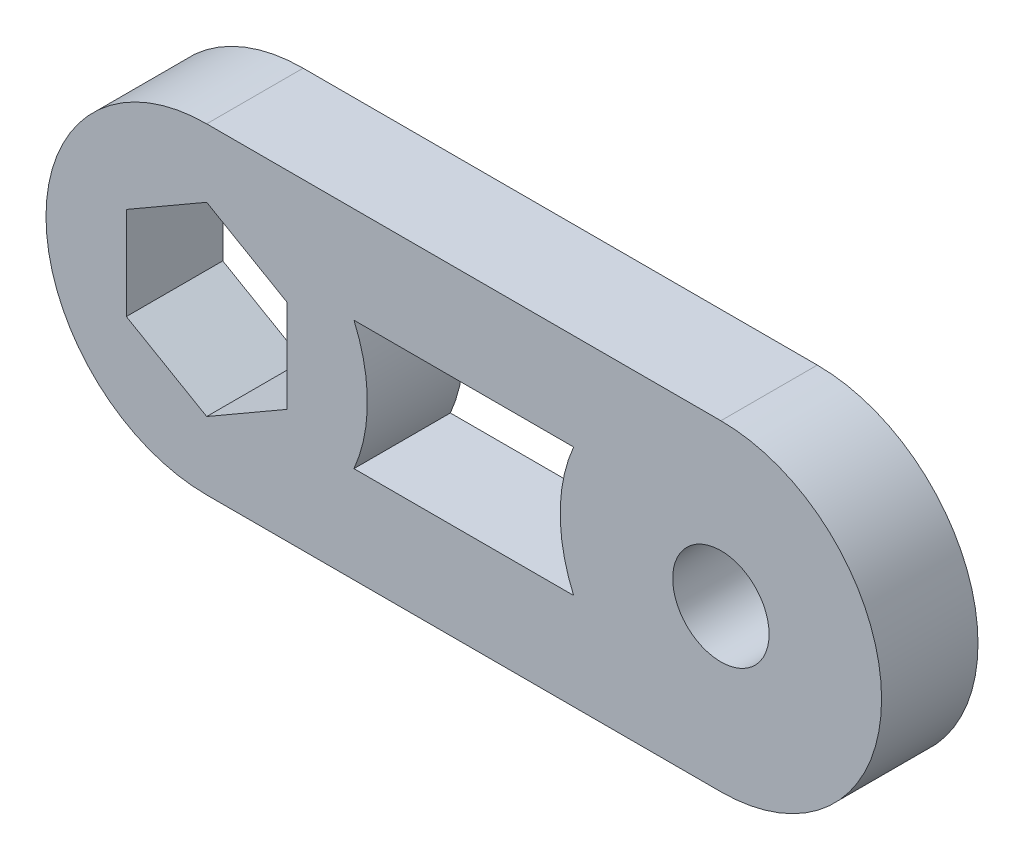
ISO-10303-21;
HEADER;
FILE_DESCRIPTION(('STEP AP214'),'2;1');
FILE_NAME('part.step','',(''),(''),'','','');
FILE_SCHEMA(('AUTOMOTIVE_DESIGN { 1 0 10303 214 1 1 1 1 }'));
ENDSEC;
DATA;
#1=APPLICATION_CONTEXT('core data for automotive mechanical design processes');
#2=APPLICATION_PROTOCOL_DEFINITION('international standard','automotive_design',2000,#1);
#3=PRODUCT_CONTEXT('',#1,'mechanical');
#4=PRODUCT('Part','Part','',(#3));
#5=PRODUCT_RELATED_PRODUCT_CATEGORY('part','',(#4));
#6=PRODUCT_DEFINITION_FORMATION('','',#4);
#7=PRODUCT_DEFINITION_CONTEXT('part definition',#1,'design');
#8=PRODUCT_DEFINITION('design','',#6,#7);
#9=PRODUCT_DEFINITION_SHAPE('','',#8);
#10=(LENGTH_UNIT() NAMED_UNIT(*) SI_UNIT(.MILLI.,.METRE.));
#11=(NAMED_UNIT(*) PLANE_ANGLE_UNIT() SI_UNIT($,.RADIAN.));
#12=(NAMED_UNIT(*) SI_UNIT($,.STERADIAN.) SOLID_ANGLE_UNIT());
#13=UNCERTAINTY_MEASURE_WITH_UNIT(LENGTH_MEASURE(1.E-05),#10,'distance_accuracy_value','');
#14=(GEOMETRIC_REPRESENTATION_CONTEXT(3) GLOBAL_UNCERTAINTY_ASSIGNED_CONTEXT((#13)) GLOBAL_UNIT_ASSIGNED_CONTEXT((#10,
#11,#12)) REPRESENTATION_CONTEXT('',''));
#15=CARTESIAN_POINT('',(0.,0.,0.));
#16=DIRECTION('',(0.,0.,1.));
#17=DIRECTION('',(1.,0.,0.));
#18=AXIS2_PLACEMENT_3D('',#15,#16,#17);
#19=CARTESIAN_POINT('',(7.99999999999999,-5.,3.));
#20=DIRECTION('',(0.,1.,0.));
#21=DIRECTION('',(0.,0.,1.));
#22=AXIS2_PLACEMENT_3D('',#19,#20,#21);
#23=PLANE('',#22);
#24=DIRECTION('',(1.,0.,0.));
#25=VECTOR('',#24,1.);
#26=CARTESIAN_POINT('',(7.99999999999999,-5.,0.));
#27=LINE('',#26,#25);
#28=CARTESIAN_POINT('',(0.,-5.,0.));
#29=VERTEX_POINT('',#28);
#30=CARTESIAN_POINT('',(15.9999999999999,-5.,0.));
#31=VERTEX_POINT('',#30);
#32=EDGE_CURVE('E211',#29,#31,#27,.T.);
#33=ORIENTED_EDGE('',*,*,#32,.T.);
#34=DIRECTION('',(0.,0.,-1.));
#35=VECTOR('',#34,1.);
#36=CARTESIAN_POINT('',(15.9999999999999,-5.,3.));
#37=LINE('',#36,#35);
#38=CARTESIAN_POINT('',(15.9999999999999,-5.,3.));
#39=VERTEX_POINT('',#38);
#40=EDGE_CURVE('E227',#39,#31,#37,.T.);
#41=ORIENTED_EDGE('',*,*,#40,.F.);
#42=DIRECTION('',(1.,0.,0.));
#43=VECTOR('',#42,1.);
#44=CARTESIAN_POINT('',(7.99999999999999,-5.,3.));
#45=LINE('',#44,#43);
#46=CARTESIAN_POINT('',(0.,-5.,3.));
#47=VERTEX_POINT('',#46);
#48=EDGE_CURVE('E196',#47,#39,#45,.T.);
#49=ORIENTED_EDGE('',*,*,#48,.F.);
#50=DIRECTION('',(0.,0.,-1.));
#51=VECTOR('',#50,1.);
#52=CARTESIAN_POINT('',(0.,-5.,3.));
#53=LINE('',#52,#51);
#54=EDGE_CURVE('E208',#47,#29,#53,.T.);
#55=ORIENTED_EDGE('',*,*,#54,.T.);
#56=EDGE_LOOP('',(#33,#41,#49,#55));
#57=FACE_BOUND('',#56,.T.);
#58=ADVANCED_FACE('F32',(#57),#23,.F.);
#59=CARTESIAN_POINT('',(16.,0.,3.));
#60=DIRECTION('',(0.,0.,-1.));
#61=DIRECTION('',(-1.,0.,0.));
#62=AXIS2_PLACEMENT_3D('',#59,#60,#61);
#63=CYLINDRICAL_SURFACE('',#62,5.);
#64=CARTESIAN_POINT('',(16.,0.,0.));
#65=DIRECTION('',(0.,0.,1.));
#66=DIRECTION('',(1.,0.,0.));
#67=AXIS2_PLACEMENT_3D('',#64,#65,#66);
#68=CIRCLE('',#67,5.);
#69=CARTESIAN_POINT('',(15.9999999999999,5.,0.));
#70=VERTEX_POINT('',#69);
#71=EDGE_CURVE('E214',#31,#70,#68,.T.);
#72=ORIENTED_EDGE('',*,*,#71,.T.);
#73=DIRECTION('',(0.,0.,-1.));
#74=VECTOR('',#73,1.);
#75=CARTESIAN_POINT('',(15.9999999999999,5.,3.));
#76=LINE('',#75,#74);
#77=CARTESIAN_POINT('',(15.9999999999999,5.,3.));
#78=VERTEX_POINT('',#77);
#79=EDGE_CURVE('E225',#78,#70,#76,.T.);
#80=ORIENTED_EDGE('',*,*,#79,.F.);
#81=CARTESIAN_POINT('',(16.,0.,3.));
#82=DIRECTION('',(0.,0.,1.));
#83=DIRECTION('',(1.,0.,0.));
#84=AXIS2_PLACEMENT_3D('',#81,#82,#83);
#85=CIRCLE('',#84,5.);
#86=EDGE_CURVE('E200',#39,#78,#85,.T.);
#87=ORIENTED_EDGE('',*,*,#86,.F.);
#88=ORIENTED_EDGE('',*,*,#40,.T.);
#89=EDGE_LOOP('',(#72,#80,#87,#88));
#90=FACE_BOUND('',#89,.T.);
#91=ADVANCED_FACE('F279',(#90),#63,.T.);
#92=CARTESIAN_POINT('',(7.99999999999999,5.,3.));
#93=DIRECTION('',(0.,1.,0.));
#94=DIRECTION('',(0.,0.,1.));
#95=AXIS2_PLACEMENT_3D('',#92,#93,#94);
#96=PLANE('',#95);
#97=DIRECTION('',(1.,0.,0.));
#98=VECTOR('',#97,1.);
#99=CARTESIAN_POINT('',(7.99999999999999,5.,0.));
#100=LINE('',#99,#98);
#101=CARTESIAN_POINT('',(0.,5.,0.));
#102=VERTEX_POINT('',#101);
#103=EDGE_CURVE('E217',#102,#70,#100,.T.);
#104=ORIENTED_EDGE('',*,*,#103,.F.);
#105=DIRECTION('',(0.,0.,-1.));
#106=VECTOR('',#105,1.);
#107=CARTESIAN_POINT('',(0.,5.,3.));
#108=LINE('',#107,#106);
#109=CARTESIAN_POINT('',(0.,5.,3.));
#110=VERTEX_POINT('',#109);
#111=EDGE_CURVE('E223',#110,#102,#108,.T.);
#112=ORIENTED_EDGE('',*,*,#111,.F.);
#113=DIRECTION('',(1.,0.,0.));
#114=VECTOR('',#113,1.);
#115=CARTESIAN_POINT('',(7.99999999999999,5.,3.));
#116=LINE('',#115,#114);
#117=EDGE_CURVE('E202',#110,#78,#116,.T.);
#118=ORIENTED_EDGE('',*,*,#117,.T.);
#119=ORIENTED_EDGE('',*,*,#79,.T.);
#120=EDGE_LOOP('',(#104,#112,#118,#119));
#121=FACE_BOUND('',#120,.T.);
#122=ADVANCED_FACE('F284',(#121),#96,.T.);
#123=CARTESIAN_POINT('',(16.,0.,3.));
#124=DIRECTION('',(0.,0.,-1.));
#125=DIRECTION('',(-1.,0.,0.));
#126=AXIS2_PLACEMENT_3D('',#123,#124,#125);
#127=CYLINDRICAL_SURFACE('',#126,1.5);
#128=CARTESIAN_POINT('',(16.,0.,3.));
#129=DIRECTION('',(0.,0.,1.));
#130=DIRECTION('',(1.,0.,0.));
#131=AXIS2_PLACEMENT_3D('',#128,#129,#130);
#132=CIRCLE('',#131,1.5);
#133=CARTESIAN_POINT('',(17.5,0.,3.));
#134=VERTEX_POINT('',#133);
#135=EDGE_CURVE('E193',#134,#134,#132,.T.);
#136=ORIENTED_EDGE('',*,*,#135,.T.);
#137=EDGE_LOOP('',(#136));
#138=FACE_BOUND('',#137,.T.);
#139=CARTESIAN_POINT('',(16.,0.,0.));
#140=DIRECTION('',(0.,0.,1.));
#141=DIRECTION('',(1.,0.,0.));
#142=AXIS2_PLACEMENT_3D('',#139,#140,#141);
#143=CIRCLE('',#142,1.5);
#144=CARTESIAN_POINT('',(17.5,0.,0.));
#145=VERTEX_POINT('',#144);
#146=EDGE_CURVE('E186',#145,#145,#143,.T.);
#147=ORIENTED_EDGE('',*,*,#146,.F.);
#148=EDGE_LOOP('',(#147));
#149=FACE_BOUND('',#148,.T.);
#150=ADVANCED_FACE('F34',(#138,#149),#127,.F.);
#151=CARTESIAN_POINT('',(0.,0.,3.));
#152=DIRECTION('',(0.,0.,-1.));
#153=DIRECTION('',(-1.,0.,0.));
#154=AXIS2_PLACEMENT_3D('',#151,#152,#153);
#155=CYLINDRICAL_SURFACE('',#154,5.);
#156=CARTESIAN_POINT('',(0.,0.,0.));
#157=DIRECTION('',(0.,0.,1.));
#158=DIRECTION('',(1.,0.,0.));
#159=AXIS2_PLACEMENT_3D('',#156,#157,#158);
#160=CIRCLE('',#159,5.);
#161=EDGE_CURVE('E197',#29,#102,#160,.F.);
#162=ORIENTED_EDGE('',*,*,#161,.F.);
#163=ORIENTED_EDGE('',*,*,#54,.F.);
#164=CARTESIAN_POINT('',(0.,0.,3.));
#165=DIRECTION('',(0.,0.,1.));
#166=DIRECTION('',(1.,0.,0.));
#167=AXIS2_PLACEMENT_3D('',#164,#165,#166);
#168=CIRCLE('',#167,5.);
#169=EDGE_CURVE('E205',#47,#110,#168,.F.);
#170=ORIENTED_EDGE('',*,*,#169,.T.);
#171=ORIENTED_EDGE('',*,*,#111,.T.);
#172=EDGE_LOOP('',(#162,#163,#170,#171));
#173=FACE_BOUND('',#172,.T.);
#174=ADVANCED_FACE('F291',(#173),#155,.T.);
#175=CARTESIAN_POINT('',(7.99999999999999,-21.8089085201887,3.));
#176=DIRECTION('',(0.,0.,1.));
#177=DIRECTION('',(1.,0.,0.));
#178=AXIS2_PLACEMENT_3D('',#175,#176,#177);
#179=PLANE('',#178);
#180=DIRECTION('',(-0.866025403784439,0.5,0.));
#181=VECTOR('',#180,1.);
#182=CARTESIAN_POINT('',(2.5,1.44337567297407,3.));
#183=LINE('',#182,#181);
#184=CARTESIAN_POINT('',(2.5,1.44337567297407,3.));
#185=VERTEX_POINT('',#184);
#186=CARTESIAN_POINT('',(0.,2.88675134594813,3.));
#187=VERTEX_POINT('',#186);
#188=EDGE_CURVE('E47',#185,#187,#183,.T.);
#189=ORIENTED_EDGE('',*,*,#188,.F.);
#190=DIRECTION('',(0.,1.,0.));
#191=VECTOR('',#190,1.);
#192=CARTESIAN_POINT('',(2.5,-1.44337567297407,3.));
#193=LINE('',#192,#191);
#194=CARTESIAN_POINT('',(2.5,-1.44337567297407,3.));
#195=VERTEX_POINT('',#194);
#196=EDGE_CURVE('E161',#195,#185,#193,.T.);
#197=ORIENTED_EDGE('',*,*,#196,.F.);
#198=DIRECTION('',(0.866025403784439,0.5,0.));
#199=VECTOR('',#198,1.);
#200=CARTESIAN_POINT('',(0.,-2.88675134594813,3.));
#201=LINE('',#200,#199);
#202=CARTESIAN_POINT('',(0.,-2.88675134594813,3.));
#203=VERTEX_POINT('',#202);
#204=EDGE_CURVE('E155',#203,#195,#201,.T.);
#205=ORIENTED_EDGE('',*,*,#204,.F.);
#206=DIRECTION('',(0.866025403784439,-0.5,0.));
#207=VECTOR('',#206,1.);
#208=CARTESIAN_POINT('',(-2.5,-1.44337567297407,3.));
#209=LINE('',#208,#207);
#210=CARTESIAN_POINT('',(-2.5,-1.44337567297407,3.));
#211=VERTEX_POINT('',#210);
#212=EDGE_CURVE('E153',#211,#203,#209,.T.);
#213=ORIENTED_EDGE('',*,*,#212,.F.);
#214=DIRECTION('',(0.,-1.,0.));
#215=VECTOR('',#214,1.);
#216=CARTESIAN_POINT('',(-2.5,1.44337567297407,3.));
#217=LINE('',#216,#215);
#218=CARTESIAN_POINT('',(-2.5,1.44337567297407,3.));
#219=VERTEX_POINT('',#218);
#220=EDGE_CURVE('E136',#219,#211,#217,.T.);
#221=ORIENTED_EDGE('',*,*,#220,.F.);
#222=DIRECTION('',(-0.866025403784439,-0.5,0.));
#223=VECTOR('',#222,1.);
#224=CARTESIAN_POINT('',(0.,2.88675134594813,3.));
#225=LINE('',#224,#223);
#226=EDGE_CURVE('E145',#187,#219,#225,.T.);
#227=ORIENTED_EDGE('',*,*,#226,.F.);
#228=EDGE_LOOP('',(#189,#197,#205,#213,#221,#227));
#229=FACE_BOUND('',#228,.T.);
#230=CARTESIAN_POINT('',(16.,0.,3.));
#231=DIRECTION('',(0.,0.,-1.));
#232=DIRECTION('',(1.,0.,0.));
#233=AXIS2_PLACEMENT_3D('',#230,#231,#232);
#234=CIRCLE('',#233,5.);
#235=CARTESIAN_POINT('',(11.4174243050441,-2.,3.));
#236=VERTEX_POINT('',#235);
#237=CARTESIAN_POINT('',(11.4174243050441,2.,3.));
#238=VERTEX_POINT('',#237);
#239=EDGE_CURVE('E166',#236,#238,#234,.T.);
#240=ORIENTED_EDGE('',*,*,#239,.F.);
#241=DIRECTION('',(1.,0.,0.));
#242=VECTOR('',#241,1.);
#243=CARTESIAN_POINT('',(4.58257569495584,-2.,3.));
#244=LINE('',#243,#242);
#245=CARTESIAN_POINT('',(4.58257569495584,-2.,3.));
#246=VERTEX_POINT('',#245);
#247=EDGE_CURVE('E180',#246,#236,#244,.T.);
#248=ORIENTED_EDGE('',*,*,#247,.F.);
#249=CARTESIAN_POINT('',(0.,0.,3.));
#250=DIRECTION('',(0.,0.,-1.));
#251=DIRECTION('',(1.,0.,0.));
#252=AXIS2_PLACEMENT_3D('',#249,#250,#251);
#253=CIRCLE('',#252,5.);
#254=CARTESIAN_POINT('',(4.58257569495584,2.,3.));
#255=VERTEX_POINT('',#254);
#256=EDGE_CURVE('E177',#255,#246,#253,.T.);
#257=ORIENTED_EDGE('',*,*,#256,.F.);
#258=DIRECTION('',(-1.,0.,0.));
#259=VECTOR('',#258,1.);
#260=CARTESIAN_POINT('',(11.4174243050441,2.,3.));
#261=LINE('',#260,#259);
#262=EDGE_CURVE('E174',#238,#255,#261,.T.);
#263=ORIENTED_EDGE('',*,*,#262,.F.);
#264=EDGE_LOOP('',(#240,#248,#257,#263));
#265=FACE_BOUND('',#264,.T.);
#266=ORIENTED_EDGE('',*,*,#135,.F.);
#267=EDGE_LOOP('',(#266));
#268=FACE_BOUND('',#267,.T.);
#269=ORIENTED_EDGE('',*,*,#48,.T.);
#270=ORIENTED_EDGE('',*,*,#86,.T.);
#271=ORIENTED_EDGE('',*,*,#117,.F.);
#272=ORIENTED_EDGE('',*,*,#169,.F.);
#273=EDGE_LOOP('',(#269,#270,#271,#272));
#274=FACE_BOUND('',#273,.T.);
#275=ADVANCED_FACE('F149',(#229,#265,#268,#274),#179,.T.);
#276=CARTESIAN_POINT('',(7.99999999999999,-21.8089085201887,0.));
#277=DIRECTION('',(0.,0.,1.));
#278=DIRECTION('',(1.,0.,0.));
#279=AXIS2_PLACEMENT_3D('',#276,#277,#278);
#280=PLANE('',#279);
#281=DIRECTION('',(0.,1.,0.));
#282=VECTOR('',#281,1.);
#283=CARTESIAN_POINT('',(2.5,-21.8089085201887,0.));
#284=LINE('',#283,#282);
#285=CARTESIAN_POINT('',(2.5,-1.44337567297407,0.));
#286=VERTEX_POINT('',#285);
#287=CARTESIAN_POINT('',(2.5,1.44337567297407,0.));
#288=VERTEX_POINT('',#287);
#289=EDGE_CURVE('E40',#286,#288,#284,.T.);
#290=ORIENTED_EDGE('',*,*,#289,.T.);
#291=DIRECTION('',(-0.866025403784439,0.5,0.));
#292=VECTOR('',#291,1.);
#293=CARTESIAN_POINT('',(16.6935344036471,-6.75126523572383,0.));
#294=LINE('',#293,#292);
#295=CARTESIAN_POINT('',(0.,2.88675134594813,0.));
#296=VERTEX_POINT('',#295);
#297=EDGE_CURVE('E11',#288,#296,#294,.T.);
#298=ORIENTED_EDGE('',*,*,#297,.T.);
#299=DIRECTION('',(-0.866025403784439,-0.5,0.));
#300=VECTOR('',#299,1.);
#301=CARTESIAN_POINT('',(-4.69353440364717,0.176937994551669,0.));
#302=LINE('',#301,#300);
#303=CARTESIAN_POINT('',(-2.5,1.44337567297407,0.));
#304=VERTEX_POINT('',#303);
#305=EDGE_CURVE('E242',#296,#304,#302,.T.);
#306=ORIENTED_EDGE('',*,*,#305,.T.);
#307=DIRECTION('',(0.,-1.,0.));
#308=VECTOR('',#307,1.);
#309=CARTESIAN_POINT('',(-2.50000000000001,-21.8089085201887,0.));
#310=LINE('',#309,#308);
#311=CARTESIAN_POINT('',(-2.5,-1.44337567297407,0.));
#312=VERTEX_POINT('',#311);
#313=EDGE_CURVE('E139',#304,#312,#310,.T.);
#314=ORIENTED_EDGE('',*,*,#313,.T.);
#315=DIRECTION('',(0.866025403784439,-0.5,0.));
#316=VECTOR('',#315,1.);
#317=CARTESIAN_POINT('',(14.1935344036472,-11.081392254646,0.));
#318=LINE('',#317,#316);
#319=CARTESIAN_POINT('',(0.,-2.88675134594813,0.));
#320=VERTEX_POINT('',#319);
#321=EDGE_CURVE('E245',#312,#320,#318,.T.);
#322=ORIENTED_EDGE('',*,*,#321,.T.);
#323=DIRECTION('',(0.866025403784439,0.5,0.));
#324=VECTOR('',#323,1.);
#325=CARTESIAN_POINT('',(-2.19353440364717,-4.15318902437052,0.));
#326=LINE('',#325,#324);
#327=EDGE_CURVE('E248',#320,#286,#326,.T.);
#328=ORIENTED_EDGE('',*,*,#327,.T.);
#329=EDGE_LOOP('',(#290,#298,#306,#314,#322,#328));
#330=FACE_BOUND('',#329,.T.);
#331=DIRECTION('',(1.,0.,0.));
#332=VECTOR('',#331,1.);
#333=CARTESIAN_POINT('',(7.99999999999999,-2.,0.));
#334=LINE('',#333,#332);
#335=CARTESIAN_POINT('',(4.58257569495584,-2.,0.));
#336=VERTEX_POINT('',#335);
#337=CARTESIAN_POINT('',(11.4174243050441,-2.,0.));
#338=VERTEX_POINT('',#337);
#339=EDGE_CURVE('E236',#336,#338,#334,.T.);
#340=ORIENTED_EDGE('',*,*,#339,.T.);
#341=CARTESIAN_POINT('',(16.,0.,0.));
#342=DIRECTION('',(0.,0.,1.));
#343=DIRECTION('',(1.,0.,0.));
#344=AXIS2_PLACEMENT_3D('',#341,#342,#343);
#345=CIRCLE('',#344,5.);
#346=CARTESIAN_POINT('',(11.4174243050441,2.,0.));
#347=VERTEX_POINT('',#346);
#348=EDGE_CURVE('E239',#338,#347,#345,.F.);
#349=ORIENTED_EDGE('',*,*,#348,.T.);
#350=DIRECTION('',(-1.,0.,0.));
#351=VECTOR('',#350,1.);
#352=CARTESIAN_POINT('',(7.99999999999999,2.,0.));
#353=LINE('',#352,#351);
#354=CARTESIAN_POINT('',(4.58257569495584,2.,0.));
#355=VERTEX_POINT('',#354);
#356=EDGE_CURVE('E230',#347,#355,#353,.T.);
#357=ORIENTED_EDGE('',*,*,#356,.T.);
#358=CARTESIAN_POINT('',(0.,0.,0.));
#359=DIRECTION('',(0.,0.,1.));
#360=DIRECTION('',(1.,0.,0.));
#361=AXIS2_PLACEMENT_3D('',#358,#359,#360);
#362=CIRCLE('',#361,5.);
#363=EDGE_CURVE('E233',#355,#336,#362,.F.);
#364=ORIENTED_EDGE('',*,*,#363,.T.);
#365=EDGE_LOOP('',(#340,#349,#357,#364));
#366=FACE_BOUND('',#365,.T.);
#367=ORIENTED_EDGE('',*,*,#146,.T.);
#368=EDGE_LOOP('',(#367));
#369=FACE_BOUND('',#368,.T.);
#370=ORIENTED_EDGE('',*,*,#32,.F.);
#371=ORIENTED_EDGE('',*,*,#161,.T.);
#372=ORIENTED_EDGE('',*,*,#103,.T.);
#373=ORIENTED_EDGE('',*,*,#71,.F.);
#374=EDGE_LOOP('',(#370,#371,#372,#373));
#375=FACE_BOUND('',#374,.T.);
#376=ADVANCED_FACE('F252',(#330,#366,#369,#375),#280,.F.);
#377=CARTESIAN_POINT('',(16.,0.,-7.));
#378=DIRECTION('',(0.,0.,1.));
#379=DIRECTION('',(1.,0.,0.));
#380=AXIS2_PLACEMENT_3D('',#377,#378,#379);
#381=CYLINDRICAL_SURFACE('',#380,5.);
#382=DIRECTION('',(0.,0.,1.));
#383=VECTOR('',#382,1.);
#384=CARTESIAN_POINT('',(11.4174243050441,-2.,-7.));
#385=LINE('',#384,#383);
#386=EDGE_CURVE('E184',#338,#236,#385,.T.);
#387=ORIENTED_EDGE('',*,*,#386,.T.);
#388=ORIENTED_EDGE('',*,*,#239,.T.);
#389=DIRECTION('',(0.,0.,1.));
#390=VECTOR('',#389,1.);
#391=CARTESIAN_POINT('',(11.4174243050441,2.,-7.));
#392=LINE('',#391,#390);
#393=EDGE_CURVE('E183',#347,#238,#392,.T.);
#394=ORIENTED_EDGE('',*,*,#393,.F.);
#395=ORIENTED_EDGE('',*,*,#348,.F.);
#396=EDGE_LOOP('',(#387,#388,#394,#395));
#397=FACE_BOUND('',#396,.T.);
#398=ADVANCED_FACE('F297',(#397),#381,.T.);
#399=CARTESIAN_POINT('',(4.58257569495584,-2.,-7.));
#400=DIRECTION('',(0.,-1.,0.));
#401=DIRECTION('',(0.,0.,-1.));
#402=AXIS2_PLACEMENT_3D('',#399,#400,#401);
#403=PLANE('',#402);
#404=DIRECTION('',(0.,0.,1.));
#405=VECTOR('',#404,1.);
#406=CARTESIAN_POINT('',(4.58257569495584,-2.,-7.));
#407=LINE('',#406,#405);
#408=EDGE_CURVE('E187',#336,#246,#407,.T.);
#409=ORIENTED_EDGE('',*,*,#408,.T.);
#410=ORIENTED_EDGE('',*,*,#247,.T.);
#411=ORIENTED_EDGE('',*,*,#386,.F.);
#412=ORIENTED_EDGE('',*,*,#339,.F.);
#413=EDGE_LOOP('',(#409,#410,#411,#412));
#414=FACE_BOUND('',#413,.T.);
#415=ADVANCED_FACE('F301',(#414),#403,.F.);
#416=CARTESIAN_POINT('',(0.,0.,-7.));
#417=DIRECTION('',(0.,0.,1.));
#418=DIRECTION('',(1.,0.,0.));
#419=AXIS2_PLACEMENT_3D('',#416,#417,#418);
#420=CYLINDRICAL_SURFACE('',#419,5.);
#421=DIRECTION('',(0.,0.,1.));
#422=VECTOR('',#421,1.);
#423=CARTESIAN_POINT('',(4.58257569495584,2.,-7.));
#424=LINE('',#423,#422);
#425=EDGE_CURVE('E189',#355,#255,#424,.T.);
#426=ORIENTED_EDGE('',*,*,#425,.T.);
#427=ORIENTED_EDGE('',*,*,#256,.T.);
#428=ORIENTED_EDGE('',*,*,#408,.F.);
#429=ORIENTED_EDGE('',*,*,#363,.F.);
#430=EDGE_LOOP('',(#426,#427,#428,#429));
#431=FACE_BOUND('',#430,.T.);
#432=ADVANCED_FACE('F273',(#431),#420,.T.);
#433=CARTESIAN_POINT('',(11.4174243050441,2.,-7.));
#434=DIRECTION('',(0.,1.,0.));
#435=DIRECTION('',(0.,0.,1.));
#436=AXIS2_PLACEMENT_3D('',#433,#434,#435);
#437=PLANE('',#436);
#438=ORIENTED_EDGE('',*,*,#393,.T.);
#439=ORIENTED_EDGE('',*,*,#262,.T.);
#440=ORIENTED_EDGE('',*,*,#425,.F.);
#441=ORIENTED_EDGE('',*,*,#356,.F.);
#442=EDGE_LOOP('',(#438,#439,#440,#441));
#443=FACE_BOUND('',#442,.T.);
#444=ADVANCED_FACE('F266',(#443),#437,.F.);
#445=CARTESIAN_POINT('',(2.5,1.44337567297407,-7.));
#446=DIRECTION('',(0.5,0.866025403784439,0.));
#447=DIRECTION('',(-0.866025403784439,0.5,0.));
#448=AXIS2_PLACEMENT_3D('',#445,#446,#447);
#449=PLANE('',#448);
#450=DIRECTION('',(0.,0.,1.));
#451=VECTOR('',#450,1.);
#452=CARTESIAN_POINT('',(2.5,1.44337567297407,-7.));
#453=LINE('',#452,#451);
#454=EDGE_CURVE('E164',#288,#185,#453,.T.);
#455=ORIENTED_EDGE('',*,*,#454,.T.);
#456=ORIENTED_EDGE('',*,*,#188,.T.);
#457=DIRECTION('',(0.,0.,1.));
#458=VECTOR('',#457,1.);
#459=CARTESIAN_POINT('',(0.,2.88675134594813,-7.));
#460=LINE('',#459,#458);
#461=EDGE_CURVE('E142',#296,#187,#460,.T.);
#462=ORIENTED_EDGE('',*,*,#461,.F.);
#463=ORIENTED_EDGE('',*,*,#297,.F.);
#464=EDGE_LOOP('',(#455,#456,#462,#463));
#465=FACE_BOUND('',#464,.T.);
#466=ADVANCED_FACE('F264',(#465),#449,.F.);
#467=CARTESIAN_POINT('',(2.5,-1.44337567297407,-7.));
#468=DIRECTION('',(1.,0.,0.));
#469=DIRECTION('',(0.,1.,0.));
#470=AXIS2_PLACEMENT_3D('',#467,#468,#469);
#471=PLANE('',#470);
#472=DIRECTION('',(0.,0.,1.));
#473=VECTOR('',#472,1.);
#474=CARTESIAN_POINT('',(2.5,-1.44337567297407,-7.));
#475=LINE('',#474,#473);
#476=EDGE_CURVE('E167',#286,#195,#475,.T.);
#477=ORIENTED_EDGE('',*,*,#476,.T.);
#478=ORIENTED_EDGE('',*,*,#196,.T.);
#479=ORIENTED_EDGE('',*,*,#454,.F.);
#480=ORIENTED_EDGE('',*,*,#289,.F.);
#481=EDGE_LOOP('',(#477,#478,#479,#480));
#482=FACE_BOUND('',#481,.T.);
#483=ADVANCED_FACE('F257',(#482),#471,.F.);
#484=CARTESIAN_POINT('',(0.,-2.88675134594813,-7.));
#485=DIRECTION('',(0.5,-0.866025403784439,0.));
#486=DIRECTION('',(0.866025403784439,0.5,0.));
#487=AXIS2_PLACEMENT_3D('',#484,#485,#486);
#488=PLANE('',#487);
#489=DIRECTION('',(0.,0.,1.));
#490=VECTOR('',#489,1.);
#491=CARTESIAN_POINT('',(0.,-2.88675134594813,-7.));
#492=LINE('',#491,#490);
#493=EDGE_CURVE('E169',#320,#203,#492,.T.);
#494=ORIENTED_EDGE('',*,*,#493,.T.);
#495=ORIENTED_EDGE('',*,*,#204,.T.);
#496=ORIENTED_EDGE('',*,*,#476,.F.);
#497=ORIENTED_EDGE('',*,*,#327,.F.);
#498=EDGE_LOOP('',(#494,#495,#496,#497));
#499=FACE_BOUND('',#498,.T.);
#500=ADVANCED_FACE('F259',(#499),#488,.F.);
#501=CARTESIAN_POINT('',(-2.5,-1.44337567297407,-7.));
#502=DIRECTION('',(-0.5,-0.866025403784438,0.));
#503=DIRECTION('',(0.866025403784439,-0.5,0.));
#504=AXIS2_PLACEMENT_3D('',#501,#502,#503);
#505=PLANE('',#504);
#506=DIRECTION('',(0.,0.,1.));
#507=VECTOR('',#506,1.);
#508=CARTESIAN_POINT('',(-2.5,-1.44337567297407,-7.));
#509=LINE('',#508,#507);
#510=EDGE_CURVE('E141',#312,#211,#509,.T.);
#511=ORIENTED_EDGE('',*,*,#510,.T.);
#512=ORIENTED_EDGE('',*,*,#212,.T.);
#513=ORIENTED_EDGE('',*,*,#493,.F.);
#514=ORIENTED_EDGE('',*,*,#321,.F.);
#515=EDGE_LOOP('',(#511,#512,#513,#514));
#516=FACE_BOUND('',#515,.T.);
#517=ADVANCED_FACE('F263',(#516),#505,.F.);
#518=CARTESIAN_POINT('',(-2.5,1.44337567297407,-7.));
#519=DIRECTION('',(-1.,0.,0.));
#520=DIRECTION('',(0.,-1.,0.));
#521=AXIS2_PLACEMENT_3D('',#518,#519,#520);
#522=PLANE('',#521);
#523=DIRECTION('',(0.,0.,1.));
#524=VECTOR('',#523,1.);
#525=CARTESIAN_POINT('',(-2.5,1.44337567297407,-7.));
#526=LINE('',#525,#524);
#527=EDGE_CURVE('E55',#304,#219,#526,.T.);
#528=ORIENTED_EDGE('',*,*,#527,.T.);
#529=ORIENTED_EDGE('',*,*,#220,.T.);
#530=ORIENTED_EDGE('',*,*,#510,.F.);
#531=ORIENTED_EDGE('',*,*,#313,.F.);
#532=EDGE_LOOP('',(#528,#529,#530,#531));
#533=FACE_BOUND('',#532,.T.);
#534=ADVANCED_FACE('F133',(#533),#522,.F.);
#535=CARTESIAN_POINT('',(0.,2.88675134594813,-7.));
#536=DIRECTION('',(-0.5,0.866025403784439,0.));
#537=DIRECTION('',(-0.866025403784439,-0.5,0.));
#538=AXIS2_PLACEMENT_3D('',#535,#536,#537);
#539=PLANE('',#538);
#540=ORIENTED_EDGE('',*,*,#461,.T.);
#541=ORIENTED_EDGE('',*,*,#226,.T.);
#542=ORIENTED_EDGE('',*,*,#527,.F.);
#543=ORIENTED_EDGE('',*,*,#305,.F.);
#544=EDGE_LOOP('',(#540,#541,#542,#543));
#545=FACE_BOUND('',#544,.T.);
#546=ADVANCED_FACE('F146',(#545),#539,.F.);
#547=CLOSED_SHELL('',(#58,#91,#122,#150,#174,#275,#376,#398,#415,#432,#444,#466,#483,#500,#517,
#534,#546));
#548=MANIFOLD_SOLID_BREP('B2',#547);
#549=ADVANCED_BREP_SHAPE_REPRESENTATION('',(#18,#548),#14);
#550=SHAPE_DEFINITION_REPRESENTATION(#9,#549);
ENDSEC;
END-ISO-10303-21;
